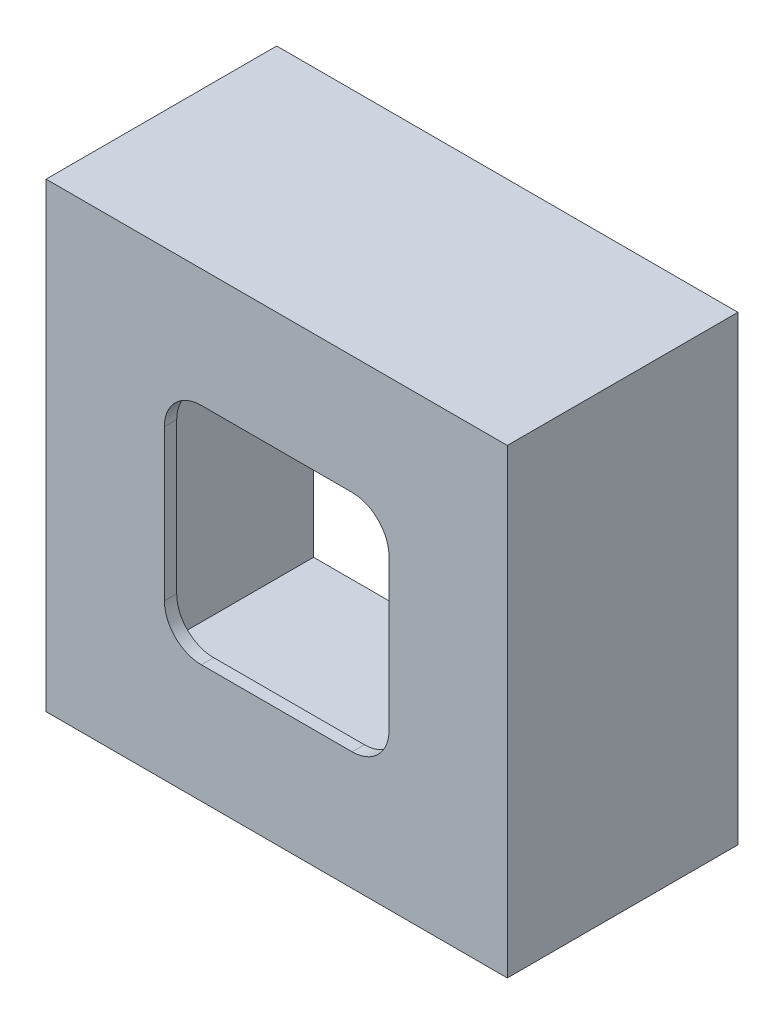
ISO-10303-21;
HEADER;
FILE_DESCRIPTION(('STEP AP214'),'2;1');
FILE_NAME('part.step','',(''),(''),'','','');
FILE_SCHEMA(('AUTOMOTIVE_DESIGN { 1 0 10303 214 1 1 1 1 }'));
ENDSEC;
DATA;
#1=APPLICATION_CONTEXT('core data for automotive mechanical design processes');
#2=APPLICATION_PROTOCOL_DEFINITION('international standard','automotive_design',2000,#1);
#3=PRODUCT_CONTEXT('',#1,'mechanical');
#4=PRODUCT('Part','Part','',(#3));
#5=PRODUCT_RELATED_PRODUCT_CATEGORY('part','',(#4));
#6=PRODUCT_DEFINITION_FORMATION('','',#4);
#7=PRODUCT_DEFINITION_CONTEXT('part definition',#1,'design');
#8=PRODUCT_DEFINITION('design','',#6,#7);
#9=PRODUCT_DEFINITION_SHAPE('','',#8);
#10=(LENGTH_UNIT() NAMED_UNIT(*) SI_UNIT(.MILLI.,.METRE.));
#11=(NAMED_UNIT(*) PLANE_ANGLE_UNIT() SI_UNIT($,.RADIAN.));
#12=(NAMED_UNIT(*) SI_UNIT($,.STERADIAN.) SOLID_ANGLE_UNIT());
#13=UNCERTAINTY_MEASURE_WITH_UNIT(LENGTH_MEASURE(1.E-05),#10,'distance_accuracy_value','');
#14=(GEOMETRIC_REPRESENTATION_CONTEXT(3) GLOBAL_UNCERTAINTY_ASSIGNED_CONTEXT((#13)) GLOBAL_UNIT_ASSIGNED_CONTEXT((#10,
#11,#12)) REPRESENTATION_CONTEXT('',''));
#15=CARTESIAN_POINT('',(0.,0.,0.));
#16=DIRECTION('',(0.,0.,1.));
#17=DIRECTION('',(1.,0.,0.));
#18=AXIS2_PLACEMENT_3D('',#15,#16,#17);
#19=CARTESIAN_POINT('',(37.5,-37.5,-108.066017177982));
#20=DIRECTION('',(0.,-1.,0.));
#21=DIRECTION('',(0.,0.,-1.));
#22=AXIS2_PLACEMENT_3D('',#19,#20,#21);
#23=PLANE('',#22);
#24=DIRECTION('',(0.,0.,1.));
#25=VECTOR('',#24,1.);
#26=CARTESIAN_POINT('',(-37.5,-37.5,-108.066017177982));
#27=LINE('',#26,#25);
#28=CARTESIAN_POINT('',(-37.5,-37.5,-37.5));
#29=VERTEX_POINT('',#28);
#30=CARTESIAN_POINT('',(-37.5,-37.5,0.));
#31=VERTEX_POINT('',#30);
#32=EDGE_CURVE('E268',#29,#31,#27,.T.);
#33=ORIENTED_EDGE('',*,*,#32,.F.);
#34=DIRECTION('',(-1.,0.,0.));
#35=VECTOR('',#34,1.);
#36=CARTESIAN_POINT('',(37.5,-37.5,-37.5));
#37=LINE('',#36,#35);
#38=CARTESIAN_POINT('',(37.5,-37.5,-37.5));
#39=VERTEX_POINT('',#38);
#40=EDGE_CURVE('E190',#39,#29,#37,.T.);
#41=ORIENTED_EDGE('',*,*,#40,.F.);
#42=DIRECTION('',(0.,0.,1.));
#43=VECTOR('',#42,1.);
#44=CARTESIAN_POINT('',(37.5,-37.5,-108.066017177982));
#45=LINE('',#44,#43);
#46=CARTESIAN_POINT('',(37.5,-37.5,0.));
#47=VERTEX_POINT('',#46);
#48=EDGE_CURVE('E273',#39,#47,#45,.T.);
#49=ORIENTED_EDGE('',*,*,#48,.T.);
#50=DIRECTION('',(1.,0.,0.));
#51=VECTOR('',#50,1.);
#52=CARTESIAN_POINT('',(37.5,-37.5,0.));
#53=LINE('',#52,#51);
#54=EDGE_CURVE('E259',#31,#47,#53,.T.);
#55=ORIENTED_EDGE('',*,*,#54,.F.);
#56=EDGE_LOOP('',(#33,#41,#49,#55));
#57=FACE_BOUND('',#56,.T.);
#58=ADVANCED_FACE('F34',(#57),#23,.T.);
#59=CARTESIAN_POINT('',(37.5,37.5,-108.066017177982));
#60=DIRECTION('',(1.,0.,0.));
#61=DIRECTION('',(0.,0.,-1.));
#62=AXIS2_PLACEMENT_3D('',#59,#60,#61);
#63=PLANE('',#62);
#64=ORIENTED_EDGE('',*,*,#48,.F.);
#65=DIRECTION('',(0.,-1.,0.));
#66=VECTOR('',#65,1.);
#67=CARTESIAN_POINT('',(37.5,37.5,-37.5));
#68=LINE('',#67,#66);
#69=CARTESIAN_POINT('',(37.5,37.5,-37.5));
#70=VERTEX_POINT('',#69);
#71=EDGE_CURVE('E164',#70,#39,#68,.T.);
#72=ORIENTED_EDGE('',*,*,#71,.F.);
#73=DIRECTION('',(0.,0.,1.));
#74=VECTOR('',#73,1.);
#75=CARTESIAN_POINT('',(37.5,37.5,-108.066017177982));
#76=LINE('',#75,#74);
#77=CARTESIAN_POINT('',(37.5,37.5,0.));
#78=VERTEX_POINT('',#77);
#79=EDGE_CURVE('E271',#70,#78,#76,.T.);
#80=ORIENTED_EDGE('',*,*,#79,.T.);
#81=DIRECTION('',(0.,1.,0.));
#82=VECTOR('',#81,1.);
#83=CARTESIAN_POINT('',(37.5,37.5,0.));
#84=LINE('',#83,#82);
#85=EDGE_CURVE('E262',#47,#78,#84,.T.);
#86=ORIENTED_EDGE('',*,*,#85,.F.);
#87=EDGE_LOOP('',(#64,#72,#80,#86));
#88=FACE_BOUND('',#87,.T.);
#89=ADVANCED_FACE('F290',(#88),#63,.T.);
#90=CARTESIAN_POINT('',(37.5,37.5,-108.066017177982));
#91=DIRECTION('',(0.,1.,0.));
#92=DIRECTION('',(0.,0.,1.));
#93=AXIS2_PLACEMENT_3D('',#90,#91,#92);
#94=PLANE('',#93);
#95=ORIENTED_EDGE('',*,*,#79,.F.);
#96=DIRECTION('',(1.,0.,0.));
#97=VECTOR('',#96,1.);
#98=CARTESIAN_POINT('',(37.5,37.5,-37.5));
#99=LINE('',#98,#97);
#100=CARTESIAN_POINT('',(-37.5,37.5,-37.5));
#101=VERTEX_POINT('',#100);
#102=EDGE_CURVE('E196',#101,#70,#99,.T.);
#103=ORIENTED_EDGE('',*,*,#102,.F.);
#104=DIRECTION('',(0.,0.,1.));
#105=VECTOR('',#104,1.);
#106=CARTESIAN_POINT('',(-37.5,37.5,-108.066017177982));
#107=LINE('',#106,#105);
#108=CARTESIAN_POINT('',(-37.5,37.5,0.));
#109=VERTEX_POINT('',#108);
#110=EDGE_CURVE('E269',#101,#109,#107,.T.);
#111=ORIENTED_EDGE('',*,*,#110,.T.);
#112=DIRECTION('',(-1.,0.,0.));
#113=VECTOR('',#112,1.);
#114=CARTESIAN_POINT('',(37.5,37.5,0.));
#115=LINE('',#114,#113);
#116=EDGE_CURVE('E265',#78,#109,#115,.T.);
#117=ORIENTED_EDGE('',*,*,#116,.F.);
#118=EDGE_LOOP('',(#95,#103,#111,#117));
#119=FACE_BOUND('',#118,.T.);
#120=ADVANCED_FACE('F285',(#119),#94,.T.);
#121=CARTESIAN_POINT('',(-37.5,37.5,-108.066017177982));
#122=DIRECTION('',(-1.,0.,0.));
#123=DIRECTION('',(0.,0.,1.));
#124=AXIS2_PLACEMENT_3D('',#121,#122,#123);
#125=PLANE('',#124);
#126=ORIENTED_EDGE('',*,*,#110,.F.);
#127=DIRECTION('',(0.,1.,0.));
#128=VECTOR('',#127,1.);
#129=CARTESIAN_POINT('',(-37.5,37.5,-37.5));
#130=LINE('',#129,#128);
#131=EDGE_CURVE('E193',#29,#101,#130,.T.);
#132=ORIENTED_EDGE('',*,*,#131,.F.);
#133=ORIENTED_EDGE('',*,*,#32,.T.);
#134=DIRECTION('',(0.,-1.,0.));
#135=VECTOR('',#134,1.);
#136=CARTESIAN_POINT('',(-37.5,37.5,0.));
#137=LINE('',#136,#135);
#138=EDGE_CURVE('E243',#109,#31,#137,.T.);
#139=ORIENTED_EDGE('',*,*,#138,.F.);
#140=EDGE_LOOP('',(#126,#132,#133,#139));
#141=FACE_BOUND('',#140,.T.);
#142=ADVANCED_FACE('F36',(#141),#125,.T.);
#143=CARTESIAN_POINT('',(0.,0.,0.));
#144=DIRECTION('',(0.,0.,-1.));
#145=DIRECTION('',(-1.,0.,0.));
#146=AXIS2_PLACEMENT_3D('',#143,#144,#145);
#147=PLANE('',#146);
#148=DIRECTION('',(0.,-1.,0.));
#149=VECTOR('',#148,1.);
#150=CARTESIAN_POINT('',(-18.2634559672906,12.2634559672906,0.));
#151=LINE('',#150,#149);
#152=CARTESIAN_POINT('',(-18.2634559672906,12.2634559672906,0.));
#153=VERTEX_POINT('',#152);
#154=CARTESIAN_POINT('',(-18.2634559672906,-12.2634559672906,0.));
#155=VERTEX_POINT('',#154);
#156=EDGE_CURVE('E219',#153,#155,#151,.T.);
#157=ORIENTED_EDGE('',*,*,#156,.F.);
#158=CARTESIAN_POINT('',(-12.2634559672906,12.2634559672906,0.));
#159=DIRECTION('',(0.,0.,1.));
#160=DIRECTION('',(1.,0.,0.));
#161=AXIS2_PLACEMENT_3D('',#158,#159,#160);
#162=CIRCLE('',#161,6.00000000000001);
#163=CARTESIAN_POINT('',(-12.2634559672906,18.2634559672906,0.));
#164=VERTEX_POINT('',#163);
#165=EDGE_CURVE('E198',#164,#153,#162,.T.);
#166=ORIENTED_EDGE('',*,*,#165,.F.);
#167=DIRECTION('',(-1.,0.,0.));
#168=VECTOR('',#167,1.);
#169=CARTESIAN_POINT('',(12.2634559672906,18.2634559672906,0.));
#170=LINE('',#169,#168);
#171=CARTESIAN_POINT('',(12.2634559672906,18.2634559672906,0.));
#172=VERTEX_POINT('',#171);
#173=EDGE_CURVE('E237',#172,#164,#170,.T.);
#174=ORIENTED_EDGE('',*,*,#173,.F.);
#175=CARTESIAN_POINT('',(12.2634559672906,12.2634559672906,0.));
#176=DIRECTION('',(0.,0.,1.));
#177=DIRECTION('',(1.,0.,0.));
#178=AXIS2_PLACEMENT_3D('',#175,#176,#177);
#179=CIRCLE('',#178,6.00000000000001);
#180=CARTESIAN_POINT('',(18.2634559672906,12.2634559672906,0.));
#181=VERTEX_POINT('',#180);
#182=EDGE_CURVE('E234',#181,#172,#179,.T.);
#183=ORIENTED_EDGE('',*,*,#182,.F.);
#184=DIRECTION('',(0.,1.,0.));
#185=VECTOR('',#184,1.);
#186=CARTESIAN_POINT('',(18.2634559672906,-12.2634559672906,0.));
#187=LINE('',#186,#185);
#188=CARTESIAN_POINT('',(18.2634559672906,-12.2634559672906,0.));
#189=VERTEX_POINT('',#188);
#190=EDGE_CURVE('E231',#189,#181,#187,.T.);
#191=ORIENTED_EDGE('',*,*,#190,.F.);
#192=CARTESIAN_POINT('',(12.2634559672906,-12.2634559672906,0.));
#193=DIRECTION('',(0.,0.,1.));
#194=DIRECTION('',(1.,0.,0.));
#195=AXIS2_PLACEMENT_3D('',#192,#193,#194);
#196=CIRCLE('',#195,6.);
#197=CARTESIAN_POINT('',(12.2634559672906,-18.2634559672906,0.));
#198=VERTEX_POINT('',#197);
#199=EDGE_CURVE('E228',#198,#189,#196,.T.);
#200=ORIENTED_EDGE('',*,*,#199,.F.);
#201=DIRECTION('',(1.,0.,0.));
#202=VECTOR('',#201,1.);
#203=CARTESIAN_POINT('',(-12.2634559672906,-18.2634559672906,0.));
#204=LINE('',#203,#202);
#205=CARTESIAN_POINT('',(-12.2634559672906,-18.2634559672906,0.));
#206=VERTEX_POINT('',#205);
#207=EDGE_CURVE('E225',#206,#198,#204,.T.);
#208=ORIENTED_EDGE('',*,*,#207,.F.);
#209=CARTESIAN_POINT('',(-12.2634559672906,-12.2634559672906,0.));
#210=DIRECTION('',(0.,0.,1.));
#211=DIRECTION('',(1.,0.,0.));
#212=AXIS2_PLACEMENT_3D('',#209,#210,#211);
#213=CIRCLE('',#212,6.);
#214=EDGE_CURVE('E222',#155,#206,#213,.T.);
#215=ORIENTED_EDGE('',*,*,#214,.F.);
#216=EDGE_LOOP('',(#157,#166,#174,#183,#191,#200,#208,#215));
#217=FACE_BOUND('',#216,.T.);
#218=ORIENTED_EDGE('',*,*,#138,.T.);
#219=ORIENTED_EDGE('',*,*,#54,.T.);
#220=ORIENTED_EDGE('',*,*,#85,.T.);
#221=ORIENTED_EDGE('',*,*,#116,.T.);
#222=EDGE_LOOP('',(#218,#219,#220,#221));
#223=FACE_BOUND('',#222,.T.);
#224=ADVANCED_FACE('F282',(#217,#223),#147,.F.);
#225=CARTESIAN_POINT('',(-18.2634559672906,12.2634559672906,-108.066017177982));
#226=DIRECTION('',(-1.,0.,0.));
#227=DIRECTION('',(0.,-1.,0.));
#228=AXIS2_PLACEMENT_3D('',#225,#226,#227);
#229=PLANE('',#228);
#230=DIRECTION('',(0.,0.,1.));
#231=VECTOR('',#230,1.);
#232=CARTESIAN_POINT('',(-18.2634559672906,-12.2634559672906,-108.066017177982));
#233=LINE('',#232,#231);
#234=CARTESIAN_POINT('',(-18.2634559672906,-12.2634559672906,-2.));
#235=VERTEX_POINT('',#234);
#236=EDGE_CURVE('E254',#235,#155,#233,.T.);
#237=ORIENTED_EDGE('',*,*,#236,.F.);
#238=DIRECTION('',(0.,1.,0.));
#239=VECTOR('',#238,1.);
#240=CARTESIAN_POINT('',(-18.2634559672906,12.2634559672906,-2.));
#241=LINE('',#240,#239);
#242=CARTESIAN_POINT('',(-18.2634559672906,12.2634559672906,-2.));
#243=VERTEX_POINT('',#242);
#244=EDGE_CURVE('E38',#235,#243,#241,.T.);
#245=ORIENTED_EDGE('',*,*,#244,.T.);
#246=DIRECTION('',(0.,0.,1.));
#247=VECTOR('',#246,1.);
#248=CARTESIAN_POINT('',(-18.2634559672906,12.2634559672906,-108.066017177982));
#249=LINE('',#248,#247);
#250=EDGE_CURVE('E240',#243,#153,#249,.T.);
#251=ORIENTED_EDGE('',*,*,#250,.T.);
#252=ORIENTED_EDGE('',*,*,#156,.T.);
#253=EDGE_LOOP('',(#237,#245,#251,#252));
#254=FACE_BOUND('',#253,.T.);
#255=ADVANCED_FACE('F301',(#254),#229,.F.);
#256=CARTESIAN_POINT('',(-12.2634559672906,-12.2634559672906,-108.066017177982));
#257=DIRECTION('',(0.,0.,1.));
#258=DIRECTION('',(1.,0.,0.));
#259=AXIS2_PLACEMENT_3D('',#256,#257,#258);
#260=CYLINDRICAL_SURFACE('',#259,6.);
#261=DIRECTION('',(0.,0.,1.));
#262=VECTOR('',#261,1.);
#263=CARTESIAN_POINT('',(-12.2634559672906,-18.2634559672906,-108.066017177982));
#264=LINE('',#263,#262);
#265=CARTESIAN_POINT('',(-12.2634559672906,-18.2634559672906,-2.));
#266=VERTEX_POINT('',#265);
#267=EDGE_CURVE('E252',#266,#206,#264,.T.);
#268=ORIENTED_EDGE('',*,*,#267,.F.);
#269=CARTESIAN_POINT('',(-12.2634559672906,-12.2634559672906,-2.));
#270=DIRECTION('',(0.,0.,1.));
#271=DIRECTION('',(1.,0.,0.));
#272=AXIS2_PLACEMENT_3D('',#269,#270,#271);
#273=CIRCLE('',#272,6.);
#274=EDGE_CURVE('E11',#266,#235,#273,.F.);
#275=ORIENTED_EDGE('',*,*,#274,.T.);
#276=ORIENTED_EDGE('',*,*,#236,.T.);
#277=ORIENTED_EDGE('',*,*,#214,.T.);
#278=EDGE_LOOP('',(#268,#275,#276,#277));
#279=FACE_BOUND('',#278,.T.);
#280=ADVANCED_FACE('F311',(#279),#260,.F.);
#281=CARTESIAN_POINT('',(-12.2634559672906,-18.2634559672906,-108.066017177982));
#282=DIRECTION('',(0.,-1.,0.));
#283=DIRECTION('',(1.,0.,0.));
#284=AXIS2_PLACEMENT_3D('',#281,#282,#283);
#285=PLANE('',#284);
#286=DIRECTION('',(0.,0.,1.));
#287=VECTOR('',#286,1.);
#288=CARTESIAN_POINT('',(12.2634559672906,-18.2634559672906,-108.066017177982));
#289=LINE('',#288,#287);
#290=CARTESIAN_POINT('',(12.2634559672906,-18.2634559672906,-2.));
#291=VERTEX_POINT('',#290);
#292=EDGE_CURVE('E250',#291,#198,#289,.T.);
#293=ORIENTED_EDGE('',*,*,#292,.F.);
#294=DIRECTION('',(-1.,0.,0.));
#295=VECTOR('',#294,1.);
#296=CARTESIAN_POINT('',(-12.2634559672906,-18.2634559672906,-2.));
#297=LINE('',#296,#295);
#298=EDGE_CURVE('E43',#291,#266,#297,.T.);
#299=ORIENTED_EDGE('',*,*,#298,.T.);
#300=ORIENTED_EDGE('',*,*,#267,.T.);
#301=ORIENTED_EDGE('',*,*,#207,.T.);
#302=EDGE_LOOP('',(#293,#299,#300,#301));
#303=FACE_BOUND('',#302,.T.);
#304=ADVANCED_FACE('F315',(#303),#285,.F.);
#305=CARTESIAN_POINT('',(12.2634559672906,-12.2634559672906,-108.066017177982));
#306=DIRECTION('',(0.,0.,1.));
#307=DIRECTION('',(1.,0.,0.));
#308=AXIS2_PLACEMENT_3D('',#305,#306,#307);
#309=CYLINDRICAL_SURFACE('',#308,6.);
#310=DIRECTION('',(0.,0.,1.));
#311=VECTOR('',#310,1.);
#312=CARTESIAN_POINT('',(18.2634559672906,-12.2634559672906,-108.066017177982));
#313=LINE('',#312,#311);
#314=CARTESIAN_POINT('',(18.2634559672906,-12.2634559672906,-2.));
#315=VERTEX_POINT('',#314);
#316=EDGE_CURVE('E248',#315,#189,#313,.T.);
#317=ORIENTED_EDGE('',*,*,#316,.F.);
#318=CARTESIAN_POINT('',(12.2634559672906,-12.2634559672906,-2.));
#319=DIRECTION('',(0.,0.,1.));
#320=DIRECTION('',(1.,0.,0.));
#321=AXIS2_PLACEMENT_3D('',#318,#319,#320);
#322=CIRCLE('',#321,6.);
#323=EDGE_CURVE('E202',#315,#291,#322,.F.);
#324=ORIENTED_EDGE('',*,*,#323,.T.);
#325=ORIENTED_EDGE('',*,*,#292,.T.);
#326=ORIENTED_EDGE('',*,*,#199,.T.);
#327=EDGE_LOOP('',(#317,#324,#325,#326));
#328=FACE_BOUND('',#327,.T.);
#329=ADVANCED_FACE('F319',(#328),#309,.F.);
#330=CARTESIAN_POINT('',(18.2634559672906,-12.2634559672906,-108.066017177982));
#331=DIRECTION('',(1.,0.,0.));
#332=DIRECTION('',(0.,1.,0.));
#333=AXIS2_PLACEMENT_3D('',#330,#331,#332);
#334=PLANE('',#333);
#335=DIRECTION('',(0.,0.,1.));
#336=VECTOR('',#335,1.);
#337=CARTESIAN_POINT('',(18.2634559672906,12.2634559672906,-108.066017177982));
#338=LINE('',#337,#336);
#339=CARTESIAN_POINT('',(18.2634559672906,12.2634559672906,-2.));
#340=VERTEX_POINT('',#339);
#341=EDGE_CURVE('E246',#340,#181,#338,.T.);
#342=ORIENTED_EDGE('',*,*,#341,.F.);
#343=DIRECTION('',(0.,-1.,0.));
#344=VECTOR('',#343,1.);
#345=CARTESIAN_POINT('',(18.2634559672906,-12.2634559672906,-2.));
#346=LINE('',#345,#344);
#347=EDGE_CURVE('E205',#340,#315,#346,.T.);
#348=ORIENTED_EDGE('',*,*,#347,.T.);
#349=ORIENTED_EDGE('',*,*,#316,.T.);
#350=ORIENTED_EDGE('',*,*,#190,.T.);
#351=EDGE_LOOP('',(#342,#348,#349,#350));
#352=FACE_BOUND('',#351,.T.);
#353=ADVANCED_FACE('F323',(#352),#334,.F.);
#354=CARTESIAN_POINT('',(12.2634559672906,12.2634559672906,-108.066017177982));
#355=DIRECTION('',(0.,0.,1.));
#356=DIRECTION('',(1.,0.,0.));
#357=AXIS2_PLACEMENT_3D('',#354,#355,#356);
#358=CYLINDRICAL_SURFACE('',#357,6.00000000000001);
#359=DIRECTION('',(0.,0.,1.));
#360=VECTOR('',#359,1.);
#361=CARTESIAN_POINT('',(12.2634559672906,18.2634559672906,-108.066017177982));
#362=LINE('',#361,#360);
#363=CARTESIAN_POINT('',(12.2634559672906,18.2634559672906,-2.));
#364=VERTEX_POINT('',#363);
#365=EDGE_CURVE('E244',#364,#172,#362,.T.);
#366=ORIENTED_EDGE('',*,*,#365,.F.);
#367=CARTESIAN_POINT('',(12.2634559672906,12.2634559672906,-2.));
#368=DIRECTION('',(0.,0.,1.));
#369=DIRECTION('',(1.,0.,0.));
#370=AXIS2_PLACEMENT_3D('',#367,#368,#369);
#371=CIRCLE('',#370,6.00000000000001);
#372=EDGE_CURVE('E208',#364,#340,#371,.F.);
#373=ORIENTED_EDGE('',*,*,#372,.T.);
#374=ORIENTED_EDGE('',*,*,#341,.T.);
#375=ORIENTED_EDGE('',*,*,#182,.T.);
#376=EDGE_LOOP('',(#366,#373,#374,#375));
#377=FACE_BOUND('',#376,.T.);
#378=ADVANCED_FACE('F327',(#377),#358,.F.);
#379=CARTESIAN_POINT('',(12.2634559672906,18.2634559672906,-108.066017177982));
#380=DIRECTION('',(0.,1.,0.));
#381=DIRECTION('',(0.,0.,1.));
#382=AXIS2_PLACEMENT_3D('',#379,#380,#381);
#383=PLANE('',#382);
#384=DIRECTION('',(0.,0.,1.));
#385=VECTOR('',#384,1.);
#386=CARTESIAN_POINT('',(-12.2634559672906,18.2634559672906,-108.066017177982));
#387=LINE('',#386,#385);
#388=CARTESIAN_POINT('',(-12.2634559672906,18.2634559672906,-2.));
#389=VERTEX_POINT('',#388);
#390=EDGE_CURVE('E241',#389,#164,#387,.T.);
#391=ORIENTED_EDGE('',*,*,#390,.F.);
#392=DIRECTION('',(1.,0.,0.));
#393=VECTOR('',#392,1.);
#394=CARTESIAN_POINT('',(12.2634559672906,18.2634559672906,-2.));
#395=LINE('',#394,#393);
#396=EDGE_CURVE('E211',#389,#364,#395,.T.);
#397=ORIENTED_EDGE('',*,*,#396,.T.);
#398=ORIENTED_EDGE('',*,*,#365,.T.);
#399=ORIENTED_EDGE('',*,*,#173,.T.);
#400=EDGE_LOOP('',(#391,#397,#398,#399));
#401=FACE_BOUND('',#400,.T.);
#402=ADVANCED_FACE('F307',(#401),#383,.F.);
#403=CARTESIAN_POINT('',(-12.2634559672906,12.2634559672906,-108.066017177982));
#404=DIRECTION('',(0.,0.,1.));
#405=DIRECTION('',(1.,0.,0.));
#406=AXIS2_PLACEMENT_3D('',#403,#404,#405);
#407=CYLINDRICAL_SURFACE('',#406,6.00000000000001);
#408=ORIENTED_EDGE('',*,*,#250,.F.);
#409=CARTESIAN_POINT('',(-12.2634559672906,12.2634559672906,-2.));
#410=DIRECTION('',(0.,0.,1.));
#411=DIRECTION('',(1.,0.,0.));
#412=AXIS2_PLACEMENT_3D('',#409,#410,#411);
#413=CIRCLE('',#412,6.00000000000001);
#414=EDGE_CURVE('E214',#243,#389,#413,.F.);
#415=ORIENTED_EDGE('',*,*,#414,.T.);
#416=ORIENTED_EDGE('',*,*,#390,.T.);
#417=ORIENTED_EDGE('',*,*,#165,.T.);
#418=EDGE_LOOP('',(#408,#415,#416,#417));
#419=FACE_BOUND('',#418,.T.);
#420=ADVANCED_FACE('F303',(#419),#407,.F.);
#421=CARTESIAN_POINT('',(0.,0.,-2.));
#422=DIRECTION('',(0.,0.,1.));
#423=DIRECTION('',(1.,0.,0.));
#424=AXIS2_PLACEMENT_3D('',#421,#422,#423);
#425=PLANE('',#424);
#426=DIRECTION('',(1.,0.,0.));
#427=VECTOR('',#426,1.);
#428=CARTESIAN_POINT('',(31.5,31.5,-2.));
#429=LINE('',#428,#427);
#430=CARTESIAN_POINT('',(-31.5,31.5,-2.));
#431=VERTEX_POINT('',#430);
#432=CARTESIAN_POINT('',(31.5,31.5,-2.));
#433=VERTEX_POINT('',#432);
#434=EDGE_CURVE('E157',#431,#433,#429,.T.);
#435=ORIENTED_EDGE('',*,*,#434,.T.);
#436=DIRECTION('',(0.,-1.,0.));
#437=VECTOR('',#436,1.);
#438=CARTESIAN_POINT('',(31.5,31.5,-2.));
#439=LINE('',#438,#437);
#440=CARTESIAN_POINT('',(31.5,-31.5,-2.));
#441=VERTEX_POINT('',#440);
#442=EDGE_CURVE('E176',#433,#441,#439,.T.);
#443=ORIENTED_EDGE('',*,*,#442,.T.);
#444=DIRECTION('',(-1.,0.,0.));
#445=VECTOR('',#444,1.);
#446=CARTESIAN_POINT('',(31.5,-31.5,-2.));
#447=LINE('',#446,#445);
#448=CARTESIAN_POINT('',(-31.5,-31.5,-2.));
#449=VERTEX_POINT('',#448);
#450=EDGE_CURVE('E163',#441,#449,#447,.T.);
#451=ORIENTED_EDGE('',*,*,#450,.T.);
#452=DIRECTION('',(0.,1.,0.));
#453=VECTOR('',#452,1.);
#454=CARTESIAN_POINT('',(-31.5,31.5,-2.));
#455=LINE('',#454,#453);
#456=EDGE_CURVE('E179',#449,#431,#455,.T.);
#457=ORIENTED_EDGE('',*,*,#456,.T.);
#458=EDGE_LOOP('',(#435,#443,#451,#457));
#459=FACE_BOUND('',#458,.T.);
#460=ORIENTED_EDGE('',*,*,#244,.F.);
#461=ORIENTED_EDGE('',*,*,#274,.F.);
#462=ORIENTED_EDGE('',*,*,#298,.F.);
#463=ORIENTED_EDGE('',*,*,#323,.F.);
#464=ORIENTED_EDGE('',*,*,#347,.F.);
#465=ORIENTED_EDGE('',*,*,#372,.F.);
#466=ORIENTED_EDGE('',*,*,#396,.F.);
#467=ORIENTED_EDGE('',*,*,#414,.F.);
#468=EDGE_LOOP('',(#460,#461,#462,#463,#464,#465,#466,#467));
#469=FACE_BOUND('',#468,.T.);
#470=ADVANCED_FACE('F306',(#459,#469),#425,.F.);
#471=CARTESIAN_POINT('',(0.,0.,-37.5));
#472=DIRECTION('',(0.,0.,-1.));
#473=DIRECTION('',(-1.,0.,0.));
#474=AXIS2_PLACEMENT_3D('',#471,#472,#473);
#475=PLANE('',#474);
#476=ORIENTED_EDGE('',*,*,#71,.T.);
#477=ORIENTED_EDGE('',*,*,#40,.T.);
#478=ORIENTED_EDGE('',*,*,#131,.T.);
#479=ORIENTED_EDGE('',*,*,#102,.T.);
#480=EDGE_LOOP('',(#476,#477,#478,#479));
#481=FACE_BOUND('',#480,.T.);
#482=DIRECTION('',(-1.,0.,0.));
#483=VECTOR('',#482,1.);
#484=CARTESIAN_POINT('',(31.5,-31.5,-37.5));
#485=LINE('',#484,#483);
#486=CARTESIAN_POINT('',(31.5,-31.5,-37.5));
#487=VERTEX_POINT('',#486);
#488=CARTESIAN_POINT('',(-31.5,-31.5,-37.5));
#489=VERTEX_POINT('',#488);
#490=EDGE_CURVE('E156',#487,#489,#485,.T.);
#491=ORIENTED_EDGE('',*,*,#490,.F.);
#492=DIRECTION('',(0.,-1.,0.));
#493=VECTOR('',#492,1.);
#494=CARTESIAN_POINT('',(31.5,31.5,-37.5));
#495=LINE('',#494,#493);
#496=CARTESIAN_POINT('',(31.5,31.5,-37.5));
#497=VERTEX_POINT('',#496);
#498=EDGE_CURVE('E148',#497,#487,#495,.T.);
#499=ORIENTED_EDGE('',*,*,#498,.F.);
#500=DIRECTION('',(1.,0.,0.));
#501=VECTOR('',#500,1.);
#502=CARTESIAN_POINT('',(31.5,31.5,-37.5));
#503=LINE('',#502,#501);
#504=CARTESIAN_POINT('',(-31.5,31.5,-37.5));
#505=VERTEX_POINT('',#504);
#506=EDGE_CURVE('E172',#505,#497,#503,.T.);
#507=ORIENTED_EDGE('',*,*,#506,.F.);
#508=DIRECTION('',(0.,1.,0.));
#509=VECTOR('',#508,1.);
#510=CARTESIAN_POINT('',(-31.5,31.5,-37.5));
#511=LINE('',#510,#509);
#512=EDGE_CURVE('E170',#489,#505,#511,.T.);
#513=ORIENTED_EDGE('',*,*,#512,.F.);
#514=EDGE_LOOP('',(#491,#499,#507,#513));
#515=FACE_BOUND('',#514,.T.);
#516=ADVANCED_FACE('F168',(#481,#515),#475,.T.);
#517=CARTESIAN_POINT('',(31.5,31.5,-37.5));
#518=DIRECTION('',(-1.,0.,0.));
#519=DIRECTION('',(0.,0.,1.));
#520=AXIS2_PLACEMENT_3D('',#517,#518,#519);
#521=PLANE('',#520);
#522=ORIENTED_EDGE('',*,*,#442,.F.);
#523=DIRECTION('',(0.,0.,1.));
#524=VECTOR('',#523,1.);
#525=CARTESIAN_POINT('',(31.5,31.5,-37.5));
#526=LINE('',#525,#524);
#527=EDGE_CURVE('E51',#497,#433,#526,.T.);
#528=ORIENTED_EDGE('',*,*,#527,.F.);
#529=ORIENTED_EDGE('',*,*,#498,.T.);
#530=DIRECTION('',(0.,0.,1.));
#531=VECTOR('',#530,1.);
#532=CARTESIAN_POINT('',(31.5,-31.5,-37.5));
#533=LINE('',#532,#531);
#534=EDGE_CURVE('E151',#487,#441,#533,.T.);
#535=ORIENTED_EDGE('',*,*,#534,.T.);
#536=EDGE_LOOP('',(#522,#528,#529,#535));
#537=FACE_BOUND('',#536,.T.);
#538=ADVANCED_FACE('F150',(#537),#521,.T.);
#539=CARTESIAN_POINT('',(31.5,-31.5,-37.5));
#540=DIRECTION('',(0.,1.,0.));
#541=DIRECTION('',(-1.,0.,0.));
#542=AXIS2_PLACEMENT_3D('',#539,#540,#541);
#543=PLANE('',#542);
#544=ORIENTED_EDGE('',*,*,#450,.F.);
#545=ORIENTED_EDGE('',*,*,#534,.F.);
#546=ORIENTED_EDGE('',*,*,#490,.T.);
#547=DIRECTION('',(0.,0.,1.));
#548=VECTOR('',#547,1.);
#549=CARTESIAN_POINT('',(-31.5,-31.5,-37.5));
#550=LINE('',#549,#548);
#551=EDGE_CURVE('E165',#489,#449,#550,.T.);
#552=ORIENTED_EDGE('',*,*,#551,.T.);
#553=EDGE_LOOP('',(#544,#545,#546,#552));
#554=FACE_BOUND('',#553,.T.);
#555=ADVANCED_FACE('F160',(#554),#543,.T.);
#556=CARTESIAN_POINT('',(-31.5,31.5,-37.5));
#557=DIRECTION('',(1.,0.,0.));
#558=DIRECTION('',(0.,0.,-1.));
#559=AXIS2_PLACEMENT_3D('',#556,#557,#558);
#560=PLANE('',#559);
#561=ORIENTED_EDGE('',*,*,#456,.F.);
#562=ORIENTED_EDGE('',*,*,#551,.F.);
#563=ORIENTED_EDGE('',*,*,#512,.T.);
#564=DIRECTION('',(0.,0.,1.));
#565=VECTOR('',#564,1.);
#566=CARTESIAN_POINT('',(-31.5,31.5,-37.5));
#567=LINE('',#566,#565);
#568=EDGE_CURVE('E185',#505,#431,#567,.T.);
#569=ORIENTED_EDGE('',*,*,#568,.T.);
#570=EDGE_LOOP('',(#561,#562,#563,#569));
#571=FACE_BOUND('',#570,.T.);
#572=ADVANCED_FACE('F344',(#571),#560,.T.);
#573=CARTESIAN_POINT('',(31.5,31.5,-37.5));
#574=DIRECTION('',(0.,-1.,0.));
#575=DIRECTION('',(1.,0.,0.));
#576=AXIS2_PLACEMENT_3D('',#573,#574,#575);
#577=PLANE('',#576);
#578=ORIENTED_EDGE('',*,*,#434,.F.);
#579=ORIENTED_EDGE('',*,*,#568,.F.);
#580=ORIENTED_EDGE('',*,*,#506,.T.);
#581=ORIENTED_EDGE('',*,*,#527,.T.);
#582=EDGE_LOOP('',(#578,#579,#580,#581));
#583=FACE_BOUND('',#582,.T.);
#584=ADVANCED_FACE('F347',(#583),#577,.T.);
#585=CLOSED_SHELL('',(#58,#89,#120,#142,#224,#255,#280,#304,#329,#353,#378,#402,#420,#470,#516,
#538,#555,#572,#584));
#586=MANIFOLD_SOLID_BREP('B2',#585);
#587=ADVANCED_BREP_SHAPE_REPRESENTATION('',(#18,#586),#14);
#588=SHAPE_DEFINITION_REPRESENTATION(#9,#587);
ENDSEC;
END-ISO-10303-21;
